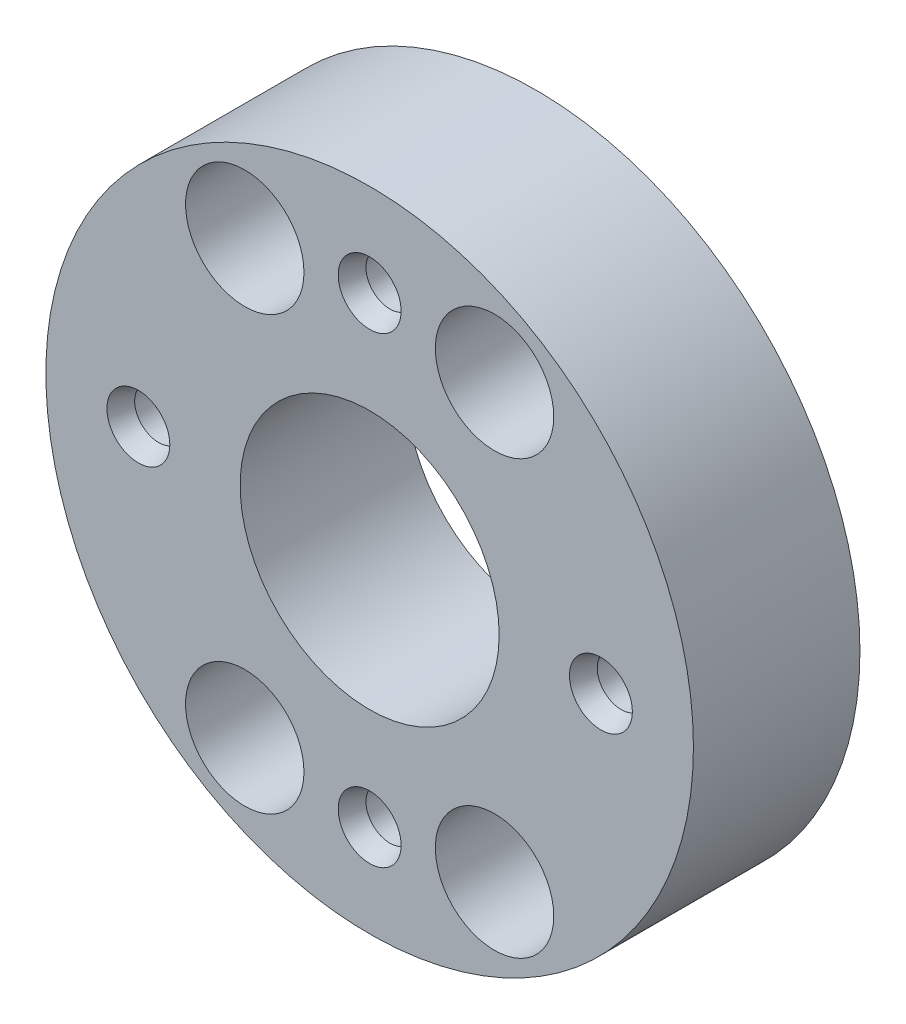
ISO-10303-21;
HEADER;
FILE_DESCRIPTION(('STEP AP214'),'2;1');
FILE_NAME('part.step','',(''),(''),'','','');
FILE_SCHEMA(('AUTOMOTIVE_DESIGN { 1 0 10303 214 1 1 1 1 }'));
ENDSEC;
DATA;
#1=APPLICATION_CONTEXT('core data for automotive mechanical design processes');
#2=APPLICATION_PROTOCOL_DEFINITION('international standard','automotive_design',2000,#1);
#3=PRODUCT_CONTEXT('',#1,'mechanical');
#4=PRODUCT('Part','Part','',(#3));
#5=PRODUCT_RELATED_PRODUCT_CATEGORY('part','',(#4));
#6=PRODUCT_DEFINITION_FORMATION('','',#4);
#7=PRODUCT_DEFINITION_CONTEXT('part definition',#1,'design');
#8=PRODUCT_DEFINITION('design','',#6,#7);
#9=PRODUCT_DEFINITION_SHAPE('','',#8);
#10=(LENGTH_UNIT() NAMED_UNIT(*) SI_UNIT(.MILLI.,.METRE.));
#11=(NAMED_UNIT(*) PLANE_ANGLE_UNIT() SI_UNIT($,.RADIAN.));
#12=(NAMED_UNIT(*) SI_UNIT($,.STERADIAN.) SOLID_ANGLE_UNIT());
#13=UNCERTAINTY_MEASURE_WITH_UNIT(LENGTH_MEASURE(1.E-05),#10,'distance_accuracy_value','');
#14=(GEOMETRIC_REPRESENTATION_CONTEXT(3) GLOBAL_UNCERTAINTY_ASSIGNED_CONTEXT((#13)) GLOBAL_UNIT_ASSIGNED_CONTEXT((#10,
#11,#12)) REPRESENTATION_CONTEXT('',''));
#15=CARTESIAN_POINT('',(0.,0.,0.));
#16=DIRECTION('',(0.,0.,1.));
#17=DIRECTION('',(1.,0.,0.));
#18=AXIS2_PLACEMENT_3D('',#15,#16,#17);
#19=CARTESIAN_POINT('',(6.74999999999997,-11.6913429510899,-13.6669047558312));
#20=DIRECTION('',(0.,0.,1.));
#21=DIRECTION('',(1.,0.,0.));
#22=AXIS2_PLACEMENT_3D('',#19,#20,#21);
#23=CYLINDRICAL_SURFACE('',#22,1.65);
#24=CARTESIAN_POINT('',(6.74999999999997,-11.6913429510899,-9.));
#25=DIRECTION('',(0.,0.,1.));
#26=DIRECTION('',(1.,0.,0.));
#27=AXIS2_PLACEMENT_3D('',#24,#25,#26);
#28=CIRCLE('',#27,1.65);
#29=CARTESIAN_POINT('',(8.39999999999997,-11.6913429510899,-9.));
#30=VERTEX_POINT('',#29);
#31=EDGE_CURVE('E86',#30,#30,#28,.F.);
#32=ORIENTED_EDGE('',*,*,#31,.T.);
#33=EDGE_LOOP('',(#32));
#34=FACE_BOUND('',#33,.T.);
#35=CARTESIAN_POINT('',(6.74999999999997,-11.6913429510899,-5.));
#36=DIRECTION('',(0.,0.,1.));
#37=DIRECTION('',(1.,0.,0.));
#38=AXIS2_PLACEMENT_3D('',#35,#36,#37);
#39=CIRCLE('',#38,1.65);
#40=CARTESIAN_POINT('',(8.39999999999997,-11.6913429510899,-5.));
#41=VERTEX_POINT('',#40);
#42=EDGE_CURVE('E45',#41,#41,#39,.F.);
#43=ORIENTED_EDGE('',*,*,#42,.F.);
#44=EDGE_LOOP('',(#43));
#45=FACE_BOUND('',#44,.T.);
#46=ADVANCED_FACE('F40',(#34,#45),#23,.F.);
#47=CARTESIAN_POINT('',(-6.75000000000005,-11.6913429510899,-13.6669047558312));
#48=DIRECTION('',(0.,0.,1.));
#49=DIRECTION('',(1.,0.,0.));
#50=AXIS2_PLACEMENT_3D('',#47,#48,#49);
#51=CYLINDRICAL_SURFACE('',#50,1.65);
#52=CARTESIAN_POINT('',(-6.75000000000005,-11.6913429510899,-9.));
#53=DIRECTION('',(0.,0.,1.));
#54=DIRECTION('',(1.,0.,0.));
#55=AXIS2_PLACEMENT_3D('',#52,#53,#54);
#56=CIRCLE('',#55,1.65);
#57=CARTESIAN_POINT('',(-5.10000000000005,-11.6913429510899,-9.));
#58=VERTEX_POINT('',#57);
#59=EDGE_CURVE('E83',#58,#58,#56,.F.);
#60=ORIENTED_EDGE('',*,*,#59,.T.);
#61=EDGE_LOOP('',(#60));
#62=FACE_BOUND('',#61,.T.);
#63=CARTESIAN_POINT('',(-6.75000000000005,-11.6913429510899,-5.));
#64=DIRECTION('',(0.,0.,1.));
#65=DIRECTION('',(1.,0.,0.));
#66=AXIS2_PLACEMENT_3D('',#63,#64,#65);
#67=CIRCLE('',#66,1.65);
#68=CARTESIAN_POINT('',(-5.10000000000005,-11.6913429510899,-5.));
#69=VERTEX_POINT('',#68);
#70=EDGE_CURVE('E64',#69,#69,#67,.F.);
#71=ORIENTED_EDGE('',*,*,#70,.F.);
#72=EDGE_LOOP('',(#71));
#73=FACE_BOUND('',#72,.T.);
#74=ADVANCED_FACE('F149',(#62,#73),#51,.F.);
#75=CARTESIAN_POINT('',(-6.74999999999989,11.69134295109,-13.6669047558312));
#76=DIRECTION('',(0.,0.,1.));
#77=DIRECTION('',(1.,0.,0.));
#78=AXIS2_PLACEMENT_3D('',#75,#76,#77);
#79=CYLINDRICAL_SURFACE('',#78,1.65);
#80=CARTESIAN_POINT('',(-6.74999999999989,11.69134295109,-9.));
#81=DIRECTION('',(0.,0.,1.));
#82=DIRECTION('',(1.,0.,0.));
#83=AXIS2_PLACEMENT_3D('',#80,#81,#82);
#84=CIRCLE('',#83,1.65);
#85=CARTESIAN_POINT('',(-5.09999999999989,11.69134295109,-9.));
#86=VERTEX_POINT('',#85);
#87=EDGE_CURVE('E87',#86,#86,#84,.F.);
#88=ORIENTED_EDGE('',*,*,#87,.T.);
#89=EDGE_LOOP('',(#88));
#90=FACE_BOUND('',#89,.T.);
#91=CARTESIAN_POINT('',(-6.74999999999989,11.69134295109,-5.));
#92=DIRECTION('',(0.,0.,1.));
#93=DIRECTION('',(1.,0.,0.));
#94=AXIS2_PLACEMENT_3D('',#91,#92,#93);
#95=CIRCLE('',#94,1.65);
#96=CARTESIAN_POINT('',(-5.09999999999989,11.69134295109,-5.));
#97=VERTEX_POINT('',#96);
#98=EDGE_CURVE('E61',#97,#97,#95,.F.);
#99=ORIENTED_EDGE('',*,*,#98,.F.);
#100=EDGE_LOOP('',(#99));
#101=FACE_BOUND('',#100,.T.);
#102=ADVANCED_FACE('F156',(#90,#101),#79,.F.);
#103=CARTESIAN_POINT('',(6.75000000000014,11.6913429510898,-13.6669047558312));
#104=DIRECTION('',(0.,0.,1.));
#105=DIRECTION('',(1.,0.,0.));
#106=AXIS2_PLACEMENT_3D('',#103,#104,#105);
#107=CYLINDRICAL_SURFACE('',#106,1.65);
#108=CARTESIAN_POINT('',(6.75000000000014,11.6913429510898,-9.));
#109=DIRECTION('',(0.,0.,1.));
#110=DIRECTION('',(1.,0.,0.));
#111=AXIS2_PLACEMENT_3D('',#108,#109,#110);
#112=CIRCLE('',#111,1.65);
#113=CARTESIAN_POINT('',(8.40000000000014,11.6913429510898,-9.));
#114=VERTEX_POINT('',#113);
#115=EDGE_CURVE('E78',#114,#114,#112,.F.);
#116=ORIENTED_EDGE('',*,*,#115,.T.);
#117=EDGE_LOOP('',(#116));
#118=FACE_BOUND('',#117,.T.);
#119=CARTESIAN_POINT('',(6.75000000000014,11.6913429510898,-5.));
#120=DIRECTION('',(0.,0.,1.));
#121=DIRECTION('',(1.,0.,0.));
#122=AXIS2_PLACEMENT_3D('',#119,#120,#121);
#123=CIRCLE('',#122,1.65);
#124=CARTESIAN_POINT('',(8.40000000000014,11.6913429510898,-5.));
#125=VERTEX_POINT('',#124);
#126=EDGE_CURVE('E58',#125,#125,#123,.F.);
#127=ORIENTED_EDGE('',*,*,#126,.F.);
#128=EDGE_LOOP('',(#127));
#129=FACE_BOUND('',#128,.T.);
#130=ADVANCED_FACE('F162',(#118,#129),#107,.F.);
#131=CARTESIAN_POINT('',(0.,0.,-9.));
#132=DIRECTION('',(0.,0.,1.));
#133=DIRECTION('',(1.,0.,0.));
#134=AXIS2_PLACEMENT_3D('',#131,#132,#133);
#135=CYLINDRICAL_SURFACE('',#134,17.5);
#136=CARTESIAN_POINT('',(0.,0.,-9.));
#137=DIRECTION('',(0.,0.,1.));
#138=DIRECTION('',(1.,0.,0.));
#139=AXIS2_PLACEMENT_3D('',#136,#137,#138);
#140=CIRCLE('',#139,17.5);
#141=CARTESIAN_POINT('',(17.5,0.,-9.));
#142=VERTEX_POINT('',#141);
#143=EDGE_CURVE('E107',#142,#142,#140,.T.);
#144=ORIENTED_EDGE('',*,*,#143,.T.);
#145=EDGE_LOOP('',(#144));
#146=FACE_BOUND('',#145,.T.);
#147=CARTESIAN_POINT('',(0.,0.,0.));
#148=DIRECTION('',(0.,0.,1.));
#149=DIRECTION('',(1.,0.,0.));
#150=AXIS2_PLACEMENT_3D('',#147,#148,#149);
#151=CIRCLE('',#150,17.5);
#152=CARTESIAN_POINT('',(17.5,0.,0.));
#153=VERTEX_POINT('',#152);
#154=EDGE_CURVE('E98',#153,#153,#151,.T.);
#155=ORIENTED_EDGE('',*,*,#154,.F.);
#156=EDGE_LOOP('',(#155));
#157=FACE_BOUND('',#156,.T.);
#158=ADVANCED_FACE('F197',(#146,#157),#135,.T.);
#159=CARTESIAN_POINT('',(0.,0.,-9.));
#160=DIRECTION('',(0.,0.,1.));
#161=DIRECTION('',(1.,0.,0.));
#162=AXIS2_PLACEMENT_3D('',#159,#160,#161);
#163=PLANE('',#162);
#164=CARTESIAN_POINT('',(0.,0.,-9.));
#165=DIRECTION('',(0.,0.,1.));
#166=DIRECTION('',(1.,0.,0.));
#167=AXIS2_PLACEMENT_3D('',#164,#165,#166);
#168=CIRCLE('',#167,7.);
#169=CARTESIAN_POINT('',(7.,0.,-9.));
#170=VERTEX_POINT('',#169);
#171=EDGE_CURVE('E73',#170,#170,#168,.F.);
#172=ORIENTED_EDGE('',*,*,#171,.F.);
#173=EDGE_LOOP('',(#172));
#174=FACE_BOUND('',#173,.T.);
#175=ORIENTED_EDGE('',*,*,#115,.F.);
#176=EDGE_LOOP('',(#175));
#177=FACE_BOUND('',#176,.T.);
#178=ORIENTED_EDGE('',*,*,#87,.F.);
#179=EDGE_LOOP('',(#178));
#180=FACE_BOUND('',#179,.T.);
#181=ORIENTED_EDGE('',*,*,#59,.F.);
#182=EDGE_LOOP('',(#181));
#183=FACE_BOUND('',#182,.T.);
#184=ORIENTED_EDGE('',*,*,#31,.F.);
#185=EDGE_LOOP('',(#184));
#186=FACE_BOUND('',#185,.T.);
#187=ORIENTED_EDGE('',*,*,#143,.F.);
#188=EDGE_LOOP('',(#187));
#189=FACE_BOUND('',#188,.T.);
#190=ADVANCED_FACE('F194',(#174,#177,#180,#183,#186,#189),#163,.F.);
#191=CARTESIAN_POINT('',(0.,0.,0.));
#192=DIRECTION('',(0.,0.,1.));
#193=DIRECTION('',(1.,0.,0.));
#194=AXIS2_PLACEMENT_3D('',#191,#192,#193);
#195=PLANE('',#194);
#196=CARTESIAN_POINT('',(-6.75000000000005,-11.6913429510899,0.));
#197=DIRECTION('',(0.,0.,1.));
#198=DIRECTION('',(1.,0.,0.));
#199=AXIS2_PLACEMENT_3D('',#196,#197,#198);
#200=CIRCLE('',#199,3.2);
#201=CARTESIAN_POINT('',(-3.55000000000005,-11.6913429510899,0.));
#202=VERTEX_POINT('',#201);
#203=EDGE_CURVE('E508',#202,#202,#200,.T.);
#204=ORIENTED_EDGE('',*,*,#203,.F.);
#205=EDGE_LOOP('',(#204));
#206=FACE_BOUND('',#205,.T.);
#207=CARTESIAN_POINT('',(6.74999999999997,-11.6913429510899,0.));
#208=DIRECTION('',(0.,0.,1.));
#209=DIRECTION('',(1.,0.,0.));
#210=AXIS2_PLACEMENT_3D('',#207,#208,#209);
#211=CIRCLE('',#210,3.2);
#212=CARTESIAN_POINT('',(9.94999999999997,-11.6913429510899,0.));
#213=VERTEX_POINT('',#212);
#214=EDGE_CURVE('E515',#213,#213,#211,.T.);
#215=ORIENTED_EDGE('',*,*,#214,.F.);
#216=EDGE_LOOP('',(#215));
#217=FACE_BOUND('',#216,.T.);
#218=CARTESIAN_POINT('',(6.75000000000014,11.6913429510898,0.));
#219=DIRECTION('',(0.,0.,1.));
#220=DIRECTION('',(1.,0.,0.));
#221=AXIS2_PLACEMENT_3D('',#218,#219,#220);
#222=CIRCLE('',#221,3.2);
#223=CARTESIAN_POINT('',(9.95000000000014,11.6913429510898,0.));
#224=VERTEX_POINT('',#223);
#225=EDGE_CURVE('E503',#224,#224,#222,.T.);
#226=ORIENTED_EDGE('',*,*,#225,.F.);
#227=EDGE_LOOP('',(#226));
#228=FACE_BOUND('',#227,.T.);
#229=CARTESIAN_POINT('',(-6.74999999999989,11.69134295109,0.));
#230=DIRECTION('',(0.,0.,1.));
#231=DIRECTION('',(1.,0.,0.));
#232=AXIS2_PLACEMENT_3D('',#229,#230,#231);
#233=CIRCLE('',#232,3.2);
#234=CARTESIAN_POINT('',(-3.54999999999989,11.69134295109,0.));
#235=VERTEX_POINT('',#234);
#236=EDGE_CURVE('E501',#235,#235,#233,.T.);
#237=ORIENTED_EDGE('',*,*,#236,.F.);
#238=EDGE_LOOP('',(#237));
#239=FACE_BOUND('',#238,.T.);
#240=CARTESIAN_POINT('',(-12.5,0.,0.));
#241=DIRECTION('',(0.,0.,1.));
#242=DIRECTION('',(1.,0.,0.));
#243=AXIS2_PLACEMENT_3D('',#240,#241,#242);
#244=CIRCLE('',#243,1.69999999999999);
#245=CARTESIAN_POINT('',(-10.8,0.,0.));
#246=VERTEX_POINT('',#245);
#247=EDGE_CURVE('E124',#246,#246,#244,.F.);
#248=ORIENTED_EDGE('',*,*,#247,.T.);
#249=EDGE_LOOP('',(#248));
#250=FACE_BOUND('',#249,.T.);
#251=CARTESIAN_POINT('',(0.,-12.5,0.));
#252=DIRECTION('',(0.,0.,1.));
#253=DIRECTION('',(1.,0.,0.));
#254=AXIS2_PLACEMENT_3D('',#251,#252,#253);
#255=CIRCLE('',#254,1.7);
#256=CARTESIAN_POINT('',(1.69999999999996,-12.5,0.));
#257=VERTEX_POINT('',#256);
#258=EDGE_CURVE('E121',#257,#257,#255,.F.);
#259=ORIENTED_EDGE('',*,*,#258,.T.);
#260=EDGE_LOOP('',(#259));
#261=FACE_BOUND('',#260,.T.);
#262=CARTESIAN_POINT('',(12.5,0.,0.));
#263=DIRECTION('',(0.,0.,1.));
#264=DIRECTION('',(1.,0.,0.));
#265=AXIS2_PLACEMENT_3D('',#262,#263,#264);
#266=CIRCLE('',#265,1.7);
#267=CARTESIAN_POINT('',(14.2,0.,0.));
#268=VERTEX_POINT('',#267);
#269=EDGE_CURVE('E118',#268,#268,#266,.F.);
#270=ORIENTED_EDGE('',*,*,#269,.T.);
#271=EDGE_LOOP('',(#270));
#272=FACE_BOUND('',#271,.T.);
#273=CARTESIAN_POINT('',(1.30930550206618E-13,12.5,0.));
#274=DIRECTION('',(0.,0.,1.));
#275=DIRECTION('',(1.,0.,0.));
#276=AXIS2_PLACEMENT_3D('',#273,#274,#275);
#277=CIRCLE('',#276,1.7);
#278=CARTESIAN_POINT('',(1.70000000000013,12.5,0.));
#279=VERTEX_POINT('',#278);
#280=EDGE_CURVE('E115',#279,#279,#277,.F.);
#281=ORIENTED_EDGE('',*,*,#280,.T.);
#282=EDGE_LOOP('',(#281));
#283=FACE_BOUND('',#282,.T.);
#284=CARTESIAN_POINT('',(0.,0.,0.));
#285=DIRECTION('',(0.,0.,1.));
#286=DIRECTION('',(1.,0.,0.));
#287=AXIS2_PLACEMENT_3D('',#284,#285,#286);
#288=CIRCLE('',#287,7.);
#289=CARTESIAN_POINT('',(7.,0.,0.));
#290=VERTEX_POINT('',#289);
#291=EDGE_CURVE('E69',#290,#290,#288,.T.);
#292=ORIENTED_EDGE('',*,*,#291,.F.);
#293=EDGE_LOOP('',(#292));
#294=FACE_BOUND('',#293,.T.);
#295=ORIENTED_EDGE('',*,*,#154,.T.);
#296=EDGE_LOOP('',(#295));
#297=FACE_BOUND('',#296,.T.);
#298=ADVANCED_FACE('F190',(#206,#217,#228,#239,#250,#261,#272,#283,#294,#297),#195,.T.);
#299=CARTESIAN_POINT('',(1.30930550206618E-13,12.5,-8.));
#300=DIRECTION('',(0.,0.,1.));
#301=DIRECTION('',(1.,0.,0.));
#302=AXIS2_PLACEMENT_3D('',#299,#300,#301);
#303=CYLINDRICAL_SURFACE('',#302,1.3);
#304=CARTESIAN_POINT('',(1.30930550206618E-13,12.5,-1.09899096778186));
#305=DIRECTION('',(0.,0.,1.));
#306=DIRECTION('',(1.,0.,0.));
#307=AXIS2_PLACEMENT_3D('',#304,#305,#306);
#308=CIRCLE('',#307,1.3);
#309=CARTESIAN_POINT('',(1.30000000000013,12.5,-1.09899096778186));
#310=VERTEX_POINT('',#309);
#311=EDGE_CURVE('E11',#310,#310,#308,.T.);
#312=ORIENTED_EDGE('',*,*,#311,.T.);
#313=EDGE_LOOP('',(#312));
#314=FACE_BOUND('',#313,.T.);
#315=CARTESIAN_POINT('',(1.30930550206618E-13,12.5,-8.));
#316=DIRECTION('',(0.,0.,1.));
#317=DIRECTION('',(1.,0.,0.));
#318=AXIS2_PLACEMENT_3D('',#315,#316,#317);
#319=CIRCLE('',#318,1.3);
#320=CARTESIAN_POINT('',(1.30000000000013,12.5,-8.));
#321=VERTEX_POINT('',#320);
#322=EDGE_CURVE('E94',#321,#321,#319,.T.);
#323=ORIENTED_EDGE('',*,*,#322,.F.);
#324=EDGE_LOOP('',(#323));
#325=FACE_BOUND('',#324,.T.);
#326=ADVANCED_FACE('F187',(#314,#325),#303,.F.);
#327=CARTESIAN_POINT('',(1.30930550206618E-13,12.5,-8.));
#328=DIRECTION('',(0.,0.,1.));
#329=DIRECTION('',(1.,0.,0.));
#330=AXIS2_PLACEMENT_3D('',#327,#328,#329);
#331=PLANE('',#330);
#332=ORIENTED_EDGE('',*,*,#322,.T.);
#333=EDGE_LOOP('',(#332));
#334=FACE_BOUND('',#333,.T.);
#335=ADVANCED_FACE('F182',(#334),#331,.T.);
#336=CARTESIAN_POINT('',(-12.5,0.,-8.));
#337=DIRECTION('',(0.,0.,1.));
#338=DIRECTION('',(1.,0.,0.));
#339=AXIS2_PLACEMENT_3D('',#336,#337,#338);
#340=CYLINDRICAL_SURFACE('',#339,1.3);
#341=CARTESIAN_POINT('',(-12.5,0.,-1.09899096778183));
#342=DIRECTION('',(0.,0.,1.));
#343=DIRECTION('',(1.,0.,0.));
#344=AXIS2_PLACEMENT_3D('',#341,#342,#343);
#345=CIRCLE('',#344,1.3);
#346=CARTESIAN_POINT('',(-11.2,0.,-1.09899096778183));
#347=VERTEX_POINT('',#346);
#348=EDGE_CURVE('E110',#347,#347,#345,.T.);
#349=ORIENTED_EDGE('',*,*,#348,.T.);
#350=EDGE_LOOP('',(#349));
#351=FACE_BOUND('',#350,.T.);
#352=CARTESIAN_POINT('',(-12.5,0.,-8.));
#353=DIRECTION('',(0.,0.,1.));
#354=DIRECTION('',(1.,0.,0.));
#355=AXIS2_PLACEMENT_3D('',#352,#353,#354);
#356=CIRCLE('',#355,1.3);
#357=CARTESIAN_POINT('',(-11.2,0.,-8.));
#358=VERTEX_POINT('',#357);
#359=EDGE_CURVE('E102',#358,#358,#356,.T.);
#360=ORIENTED_EDGE('',*,*,#359,.F.);
#361=EDGE_LOOP('',(#360));
#362=FACE_BOUND('',#361,.T.);
#363=ADVANCED_FACE('F179',(#351,#362),#340,.F.);
#364=CARTESIAN_POINT('',(-12.5,0.,-8.));
#365=DIRECTION('',(0.,0.,1.));
#366=DIRECTION('',(1.,0.,0.));
#367=AXIS2_PLACEMENT_3D('',#364,#365,#366);
#368=PLANE('',#367);
#369=ORIENTED_EDGE('',*,*,#359,.T.);
#370=EDGE_LOOP('',(#369));
#371=FACE_BOUND('',#370,.T.);
#372=ADVANCED_FACE('F175',(#371),#368,.T.);
#373=CARTESIAN_POINT('',(0.,-12.5,-8.));
#374=DIRECTION('',(0.,0.,1.));
#375=DIRECTION('',(1.,0.,0.));
#376=AXIS2_PLACEMENT_3D('',#373,#374,#375);
#377=CYLINDRICAL_SURFACE('',#376,1.3);
#378=CARTESIAN_POINT('',(0.,-12.5,-1.09899096778186));
#379=DIRECTION('',(0.,0.,1.));
#380=DIRECTION('',(1.,0.,0.));
#381=AXIS2_PLACEMENT_3D('',#378,#379,#380);
#382=CIRCLE('',#381,1.3);
#383=CARTESIAN_POINT('',(1.29999999999996,-12.5,-1.09899096778186));
#384=VERTEX_POINT('',#383);
#385=EDGE_CURVE('E54',#384,#384,#382,.T.);
#386=ORIENTED_EDGE('',*,*,#385,.T.);
#387=EDGE_LOOP('',(#386));
#388=FACE_BOUND('',#387,.T.);
#389=CARTESIAN_POINT('',(0.,-12.5,-8.));
#390=DIRECTION('',(0.,0.,1.));
#391=DIRECTION('',(1.,0.,0.));
#392=AXIS2_PLACEMENT_3D('',#389,#390,#391);
#393=CIRCLE('',#392,1.3);
#394=CARTESIAN_POINT('',(1.29999999999996,-12.5,-8.));
#395=VERTEX_POINT('',#394);
#396=EDGE_CURVE('E99',#395,#395,#393,.T.);
#397=ORIENTED_EDGE('',*,*,#396,.F.);
#398=EDGE_LOOP('',(#397));
#399=FACE_BOUND('',#398,.T.);
#400=ADVANCED_FACE('F129',(#388,#399),#377,.F.);
#401=CARTESIAN_POINT('',(0.,-12.5,-8.));
#402=DIRECTION('',(0.,0.,1.));
#403=DIRECTION('',(1.,0.,0.));
#404=AXIS2_PLACEMENT_3D('',#401,#402,#403);
#405=PLANE('',#404);
#406=ORIENTED_EDGE('',*,*,#396,.T.);
#407=EDGE_LOOP('',(#406));
#408=FACE_BOUND('',#407,.T.);
#409=ADVANCED_FACE('F171',(#408),#405,.T.);
#410=CARTESIAN_POINT('',(12.5,0.,-8.));
#411=DIRECTION('',(0.,0.,1.));
#412=DIRECTION('',(1.,0.,0.));
#413=AXIS2_PLACEMENT_3D('',#410,#411,#412);
#414=CYLINDRICAL_SURFACE('',#413,1.3);
#415=CARTESIAN_POINT('',(12.5,0.,-1.09899096778186));
#416=DIRECTION('',(0.,0.,1.));
#417=DIRECTION('',(1.,0.,0.));
#418=AXIS2_PLACEMENT_3D('',#415,#416,#417);
#419=CIRCLE('',#418,1.3);
#420=CARTESIAN_POINT('',(13.8,0.,-1.09899096778186));
#421=VERTEX_POINT('',#420);
#422=EDGE_CURVE('E49',#421,#421,#419,.T.);
#423=ORIENTED_EDGE('',*,*,#422,.T.);
#424=EDGE_LOOP('',(#423));
#425=FACE_BOUND('',#424,.T.);
#426=CARTESIAN_POINT('',(12.5,0.,-8.));
#427=DIRECTION('',(0.,0.,1.));
#428=DIRECTION('',(1.,0.,0.));
#429=AXIS2_PLACEMENT_3D('',#426,#427,#428);
#430=CIRCLE('',#429,1.3);
#431=CARTESIAN_POINT('',(13.8,0.,-8.));
#432=VERTEX_POINT('',#431);
#433=EDGE_CURVE('E95',#432,#432,#430,.T.);
#434=ORIENTED_EDGE('',*,*,#433,.F.);
#435=EDGE_LOOP('',(#434));
#436=FACE_BOUND('',#435,.T.);
#437=ADVANCED_FACE('F167',(#425,#436),#414,.F.);
#438=CARTESIAN_POINT('',(12.5,0.,-8.));
#439=DIRECTION('',(0.,0.,1.));
#440=DIRECTION('',(1.,0.,0.));
#441=AXIS2_PLACEMENT_3D('',#438,#439,#440);
#442=PLANE('',#441);
#443=ORIENTED_EDGE('',*,*,#433,.T.);
#444=EDGE_LOOP('',(#443));
#445=FACE_BOUND('',#444,.T.);
#446=ADVANCED_FACE('F164',(#445),#442,.T.);
#447=CARTESIAN_POINT('',(0.,0.,-28.7989898732233));
#448=DIRECTION('',(0.,0.,1.));
#449=DIRECTION('',(1.,0.,0.));
#450=AXIS2_PLACEMENT_3D('',#447,#448,#449);
#451=CYLINDRICAL_SURFACE('',#450,7.);
#452=ORIENTED_EDGE('',*,*,#171,.T.);
#453=EDGE_LOOP('',(#452));
#454=FACE_BOUND('',#453,.T.);
#455=ORIENTED_EDGE('',*,*,#291,.T.);
#456=EDGE_LOOP('',(#455));
#457=FACE_BOUND('',#456,.T.);
#458=ADVANCED_FACE('F143',(#454,#457),#451,.F.);
#459=CARTESIAN_POINT('',(-12.5,0.,-1.09899096778183));
#460=DIRECTION('',(0.,0.,1.));
#461=DIRECTION('',(1.,0.,0.));
#462=AXIS2_PLACEMENT_3D('',#459,#460,#461);
#463=CONICAL_SURFACE('',#462,1.3,0.349065850398865);
#464=ORIENTED_EDGE('',*,*,#247,.F.);
#465=EDGE_LOOP('',(#464));
#466=FACE_BOUND('',#465,.T.);
#467=ORIENTED_EDGE('',*,*,#348,.F.);
#468=EDGE_LOOP('',(#467));
#469=FACE_BOUND('',#468,.T.);
#470=ADVANCED_FACE('F135',(#466,#469),#463,.F.);
#471=CARTESIAN_POINT('',(0.,-12.5,-1.09899096778186));
#472=DIRECTION('',(0.,0.,1.));
#473=DIRECTION('',(1.,0.,0.));
#474=AXIS2_PLACEMENT_3D('',#471,#472,#473);
#475=CONICAL_SURFACE('',#474,1.3,0.349065850398867);
#476=ORIENTED_EDGE('',*,*,#258,.F.);
#477=EDGE_LOOP('',(#476));
#478=FACE_BOUND('',#477,.T.);
#479=ORIENTED_EDGE('',*,*,#385,.F.);
#480=EDGE_LOOP('',(#479));
#481=FACE_BOUND('',#480,.T.);
#482=ADVANCED_FACE('F132',(#478,#481),#475,.F.);
#483=CARTESIAN_POINT('',(12.5,0.,-1.09899096778186));
#484=DIRECTION('',(0.,0.,1.));
#485=DIRECTION('',(1.,0.,0.));
#486=AXIS2_PLACEMENT_3D('',#483,#484,#485);
#487=CONICAL_SURFACE('',#486,1.3,0.349065850398867);
#488=ORIENTED_EDGE('',*,*,#269,.F.);
#489=EDGE_LOOP('',(#488));
#490=FACE_BOUND('',#489,.T.);
#491=ORIENTED_EDGE('',*,*,#422,.F.);
#492=EDGE_LOOP('',(#491));
#493=FACE_BOUND('',#492,.T.);
#494=ADVANCED_FACE('F134',(#490,#493),#487,.F.);
#495=CARTESIAN_POINT('',(1.30930550206618E-13,12.5,-1.09899096778186));
#496=DIRECTION('',(0.,0.,1.));
#497=DIRECTION('',(1.,0.,0.));
#498=AXIS2_PLACEMENT_3D('',#495,#496,#497);
#499=CONICAL_SURFACE('',#498,1.3,0.349065850398867);
#500=ORIENTED_EDGE('',*,*,#280,.F.);
#501=EDGE_LOOP('',(#500));
#502=FACE_BOUND('',#501,.T.);
#503=ORIENTED_EDGE('',*,*,#311,.F.);
#504=EDGE_LOOP('',(#503));
#505=FACE_BOUND('',#504,.T.);
#506=ADVANCED_FACE('F43',(#502,#505),#499,.F.);
#507=CARTESIAN_POINT('',(0.,0.,-5.));
#508=DIRECTION('',(0.,0.,1.));
#509=DIRECTION('',(1.,0.,0.));
#510=AXIS2_PLACEMENT_3D('',#507,#508,#509);
#511=PLANE('',#510);
#512=CARTESIAN_POINT('',(6.75000000000014,11.6913429510898,-5.));
#513=DIRECTION('',(0.,0.,1.));
#514=DIRECTION('',(1.,0.,0.));
#515=AXIS2_PLACEMENT_3D('',#512,#513,#514);
#516=CIRCLE('',#515,3.2);
#517=CARTESIAN_POINT('',(9.95000000000014,11.6913429510898,-5.));
#518=VERTEX_POINT('',#517);
#519=EDGE_CURVE('E505',#518,#518,#516,.F.);
#520=ORIENTED_EDGE('',*,*,#519,.F.);
#521=EDGE_LOOP('',(#520));
#522=FACE_BOUND('',#521,.T.);
#523=ORIENTED_EDGE('',*,*,#126,.T.);
#524=EDGE_LOOP('',(#523));
#525=FACE_BOUND('',#524,.T.);
#526=ADVANCED_FACE('F231',(#522,#525),#511,.T.);
#527=CARTESIAN_POINT('',(6.75000000000014,11.6913429510898,-18.0509667991878));
#528=DIRECTION('',(0.,0.,1.));
#529=DIRECTION('',(1.,0.,0.));
#530=AXIS2_PLACEMENT_3D('',#527,#528,#529);
#531=CYLINDRICAL_SURFACE('',#530,3.2);
#532=ORIENTED_EDGE('',*,*,#519,.T.);
#533=EDGE_LOOP('',(#532));
#534=FACE_BOUND('',#533,.T.);
#535=ORIENTED_EDGE('',*,*,#225,.T.);
#536=EDGE_LOOP('',(#535));
#537=FACE_BOUND('',#536,.T.);
#538=ADVANCED_FACE('F233',(#534,#537),#531,.F.);
#539=CARTESIAN_POINT('',(0.,0.,-5.));
#540=DIRECTION('',(0.,0.,1.));
#541=DIRECTION('',(1.,0.,0.));
#542=AXIS2_PLACEMENT_3D('',#539,#540,#541);
#543=PLANE('',#542);
#544=CARTESIAN_POINT('',(-6.74999999999989,11.69134295109,-5.));
#545=DIRECTION('',(0.,0.,1.));
#546=DIRECTION('',(1.,0.,0.));
#547=AXIS2_PLACEMENT_3D('',#544,#545,#546);
#548=CIRCLE('',#547,3.2);
#549=CARTESIAN_POINT('',(-3.54999999999989,11.69134295109,-5.));
#550=VERTEX_POINT('',#549);
#551=EDGE_CURVE('E62',#550,#550,#548,.F.);
#552=ORIENTED_EDGE('',*,*,#551,.F.);
#553=EDGE_LOOP('',(#552));
#554=FACE_BOUND('',#553,.T.);
#555=ORIENTED_EDGE('',*,*,#98,.T.);
#556=EDGE_LOOP('',(#555));
#557=FACE_BOUND('',#556,.T.);
#558=ADVANCED_FACE('F240',(#554,#557),#543,.T.);
#559=CARTESIAN_POINT('',(-6.74999999999989,11.69134295109,-18.0509667991878));
#560=DIRECTION('',(0.,0.,1.));
#561=DIRECTION('',(1.,0.,0.));
#562=AXIS2_PLACEMENT_3D('',#559,#560,#561);
#563=CYLINDRICAL_SURFACE('',#562,3.2);
#564=ORIENTED_EDGE('',*,*,#551,.T.);
#565=EDGE_LOOP('',(#564));
#566=FACE_BOUND('',#565,.T.);
#567=ORIENTED_EDGE('',*,*,#236,.T.);
#568=EDGE_LOOP('',(#567));
#569=FACE_BOUND('',#568,.T.);
#570=ADVANCED_FACE('F261',(#566,#569),#563,.F.);
#571=CARTESIAN_POINT('',(0.,0.,-5.));
#572=DIRECTION('',(0.,0.,1.));
#573=DIRECTION('',(1.,0.,0.));
#574=AXIS2_PLACEMENT_3D('',#571,#572,#573);
#575=PLANE('',#574);
#576=CARTESIAN_POINT('',(-6.75000000000005,-11.6913429510899,-5.));
#577=DIRECTION('',(0.,0.,1.));
#578=DIRECTION('',(1.,0.,0.));
#579=AXIS2_PLACEMENT_3D('',#576,#577,#578);
#580=CIRCLE('',#579,3.2);
#581=CARTESIAN_POINT('',(-3.55000000000005,-11.6913429510899,-5.));
#582=VERTEX_POINT('',#581);
#583=EDGE_CURVE('E512',#582,#582,#580,.F.);
#584=ORIENTED_EDGE('',*,*,#583,.F.);
#585=EDGE_LOOP('',(#584));
#586=FACE_BOUND('',#585,.T.);
#587=ORIENTED_EDGE('',*,*,#70,.T.);
#588=EDGE_LOOP('',(#587));
#589=FACE_BOUND('',#588,.T.);
#590=ADVANCED_FACE('F257',(#586,#589),#575,.T.);
#591=CARTESIAN_POINT('',(-6.75000000000005,-11.6913429510899,-18.0509667991878));
#592=DIRECTION('',(0.,0.,1.));
#593=DIRECTION('',(1.,0.,0.));
#594=AXIS2_PLACEMENT_3D('',#591,#592,#593);
#595=CYLINDRICAL_SURFACE('',#594,3.2);
#596=ORIENTED_EDGE('',*,*,#583,.T.);
#597=EDGE_LOOP('',(#596));
#598=FACE_BOUND('',#597,.T.);
#599=ORIENTED_EDGE('',*,*,#203,.T.);
#600=EDGE_LOOP('',(#599));
#601=FACE_BOUND('',#600,.T.);
#602=ADVANCED_FACE('F253',(#598,#601),#595,.F.);
#603=CARTESIAN_POINT('',(0.,0.,-5.));
#604=DIRECTION('',(0.,0.,1.));
#605=DIRECTION('',(1.,0.,0.));
#606=AXIS2_PLACEMENT_3D('',#603,#604,#605);
#607=PLANE('',#606);
#608=CARTESIAN_POINT('',(6.74999999999997,-11.6913429510899,-5.));
#609=DIRECTION('',(0.,0.,1.));
#610=DIRECTION('',(1.,0.,0.));
#611=AXIS2_PLACEMENT_3D('',#608,#609,#610);
#612=CIRCLE('',#611,3.2);
#613=CARTESIAN_POINT('',(9.94999999999997,-11.6913429510899,-5.));
#614=VERTEX_POINT('',#613);
#615=EDGE_CURVE('E511',#614,#614,#612,.F.);
#616=ORIENTED_EDGE('',*,*,#615,.F.);
#617=EDGE_LOOP('',(#616));
#618=FACE_BOUND('',#617,.T.);
#619=ORIENTED_EDGE('',*,*,#42,.T.);
#620=EDGE_LOOP('',(#619));
#621=FACE_BOUND('',#620,.T.);
#622=ADVANCED_FACE('F249',(#618,#621),#607,.T.);
#623=CARTESIAN_POINT('',(6.74999999999997,-11.6913429510899,-18.0509667991878));
#624=DIRECTION('',(0.,0.,1.));
#625=DIRECTION('',(1.,0.,0.));
#626=AXIS2_PLACEMENT_3D('',#623,#624,#625);
#627=CYLINDRICAL_SURFACE('',#626,3.2);
#628=ORIENTED_EDGE('',*,*,#615,.T.);
#629=EDGE_LOOP('',(#628));
#630=FACE_BOUND('',#629,.T.);
#631=ORIENTED_EDGE('',*,*,#214,.T.);
#632=EDGE_LOOP('',(#631));
#633=FACE_BOUND('',#632,.T.);
#634=ADVANCED_FACE('F246',(#630,#633),#627,.F.);
#635=CLOSED_SHELL('',(#46,#74,#102,#130,#158,#190,#298,#326,#335,#363,#372,#400,#409,#437,#446,
#458,#470,#482,#494,#506,#526,#538,#558,#570,#590,#602,#622,#634));
#636=MANIFOLD_SOLID_BREP('B2',#635);
#637=ADVANCED_BREP_SHAPE_REPRESENTATION('',(#18,#636),#14);
#638=SHAPE_DEFINITION_REPRESENTATION(#9,#637);
ENDSEC;
END-ISO-10303-21;
